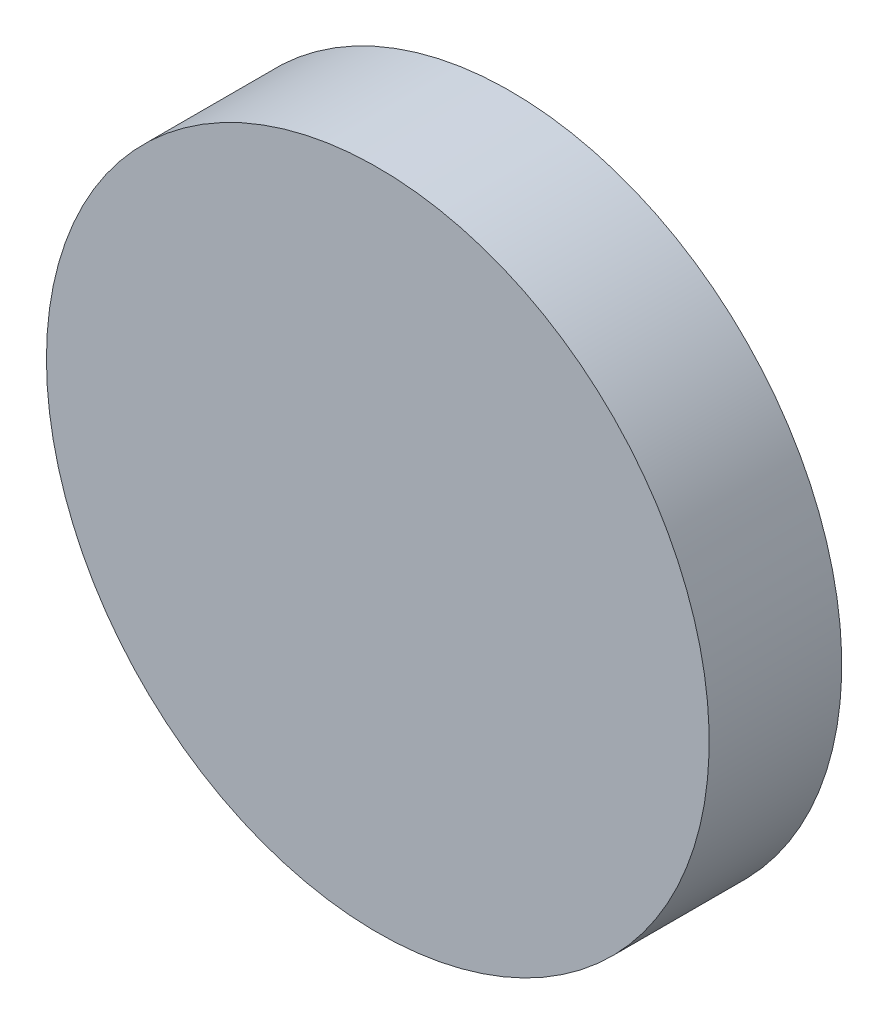
ISO-10303-21;
HEADER;
FILE_DESCRIPTION(('STEP AP214'),'2;1');
FILE_NAME('part.step','',(''),(''),'','','');
FILE_SCHEMA(('AUTOMOTIVE_DESIGN { 1 0 10303 214 1 1 1 1 }'));
ENDSEC;
DATA;
#1=APPLICATION_CONTEXT('core data for automotive mechanical design processes');
#2=APPLICATION_PROTOCOL_DEFINITION('international standard','automotive_design',2000,#1);
#3=PRODUCT_CONTEXT('',#1,'mechanical');
#4=PRODUCT('Part','Part','',(#3));
#5=PRODUCT_RELATED_PRODUCT_CATEGORY('part','',(#4));
#6=PRODUCT_DEFINITION_FORMATION('','',#4);
#7=PRODUCT_DEFINITION_CONTEXT('part definition',#1,'design');
#8=PRODUCT_DEFINITION('design','',#6,#7);
#9=PRODUCT_DEFINITION_SHAPE('','',#8);
#10=(LENGTH_UNIT() NAMED_UNIT(*) SI_UNIT(.MILLI.,.METRE.));
#11=(NAMED_UNIT(*) PLANE_ANGLE_UNIT() SI_UNIT($,.RADIAN.));
#12=(NAMED_UNIT(*) SI_UNIT($,.STERADIAN.) SOLID_ANGLE_UNIT());
#13=UNCERTAINTY_MEASURE_WITH_UNIT(LENGTH_MEASURE(1.E-05),#10,'distance_accuracy_value','');
#14=(GEOMETRIC_REPRESENTATION_CONTEXT(3) GLOBAL_UNCERTAINTY_ASSIGNED_CONTEXT((#13)) GLOBAL_UNIT_ASSIGNED_CONTEXT((#10,
#11,#12)) REPRESENTATION_CONTEXT('',''));
#15=CARTESIAN_POINT('',(0.,0.,0.));
#16=DIRECTION('',(0.,0.,1.));
#17=DIRECTION('',(1.,0.,0.));
#18=AXIS2_PLACEMENT_3D('',#15,#16,#17);
#19=CARTESIAN_POINT('',(0.,0.,20.));
#20=DIRECTION('',(0.,0.,1.));
#21=DIRECTION('',(1.,0.,0.));
#22=AXIS2_PLACEMENT_3D('',#19,#20,#21);
#23=PLANE('',#22);
#24=CARTESIAN_POINT('',(0.,0.,20.));
#25=DIRECTION('',(0.,0.,-1.));
#26=DIRECTION('',(-1.,0.,0.));
#27=AXIS2_PLACEMENT_3D('',#24,#25,#26);
#28=CIRCLE('',#27,50.);
#29=CARTESIAN_POINT('',(-50.,0.,20.));
#30=VERTEX_POINT('',#29);
#31=EDGE_CURVE('E54',#30,#30,#28,.T.);
#32=ORIENTED_EDGE('',*,*,#31,.F.);
#33=EDGE_LOOP('',(#32));
#34=FACE_BOUND('',#33,.T.);
#35=ADVANCED_FACE('F37',(#34),#23,.T.);
#36=CARTESIAN_POINT('',(0.,0.,10.));
#37=DIRECTION('',(0.,0.,1.));
#38=DIRECTION('',(1.,0.,0.));
#39=AXIS2_PLACEMENT_3D('',#36,#37,#38);
#40=PLANE('',#39);
#41=CARTESIAN_POINT('',(0.,0.,10.));
#42=DIRECTION('',(0.,0.,-1.));
#43=DIRECTION('',(-1.,0.,0.));
#44=AXIS2_PLACEMENT_3D('',#41,#42,#43);
#45=CIRCLE('',#44,40.);
#46=CARTESIAN_POINT('',(-40.,0.,10.));
#47=VERTEX_POINT('',#46);
#48=EDGE_CURVE('E10',#47,#47,#45,.T.);
#49=ORIENTED_EDGE('',*,*,#48,.T.);
#50=EDGE_LOOP('',(#49));
#51=FACE_BOUND('',#50,.T.);
#52=ADVANCED_FACE('F65',(#51),#40,.F.);
#53=CARTESIAN_POINT('',(0.,0.,0.));
#54=DIRECTION('',(0.,0.,-1.));
#55=DIRECTION('',(-1.,0.,0.));
#56=AXIS2_PLACEMENT_3D('',#53,#54,#55);
#57=CYLINDRICAL_SURFACE('',#56,40.);
#58=ORIENTED_EDGE('',*,*,#48,.F.);
#59=EDGE_LOOP('',(#58));
#60=FACE_BOUND('',#59,.T.);
#61=CARTESIAN_POINT('',(0.,0.,0.));
#62=DIRECTION('',(0.,0.,-1.));
#63=DIRECTION('',(-1.,0.,0.));
#64=AXIS2_PLACEMENT_3D('',#61,#62,#63);
#65=CIRCLE('',#64,40.);
#66=CARTESIAN_POINT('',(-40.,0.,0.));
#67=VERTEX_POINT('',#66);
#68=EDGE_CURVE('E44',#67,#67,#65,.T.);
#69=ORIENTED_EDGE('',*,*,#68,.T.);
#70=EDGE_LOOP('',(#69));
#71=FACE_BOUND('',#70,.T.);
#72=ADVANCED_FACE('F69',(#60,#71),#57,.F.);
#73=CARTESIAN_POINT('',(0.,0.,0.));
#74=DIRECTION('',(0.,0.,1.));
#75=DIRECTION('',(1.,0.,0.));
#76=AXIS2_PLACEMENT_3D('',#73,#74,#75);
#77=PLANE('',#76);
#78=ORIENTED_EDGE('',*,*,#68,.F.);
#79=EDGE_LOOP('',(#78));
#80=FACE_BOUND('',#79,.T.);
#81=CARTESIAN_POINT('',(0.,0.,0.));
#82=DIRECTION('',(0.,0.,-1.));
#83=DIRECTION('',(-1.,0.,0.));
#84=AXIS2_PLACEMENT_3D('',#81,#82,#83);
#85=CIRCLE('',#84,50.);
#86=CARTESIAN_POINT('',(-50.,0.,0.));
#87=VERTEX_POINT('',#86);
#88=EDGE_CURVE('E49',#87,#87,#85,.T.);
#89=ORIENTED_EDGE('',*,*,#88,.T.);
#90=EDGE_LOOP('',(#89));
#91=FACE_BOUND('',#90,.T.);
#92=ADVANCED_FACE('F73',(#80,#91),#77,.F.);
#93=CARTESIAN_POINT('',(0.,0.,0.));
#94=DIRECTION('',(0.,0.,-1.));
#95=DIRECTION('',(-1.,0.,0.));
#96=AXIS2_PLACEMENT_3D('',#93,#94,#95);
#97=CYLINDRICAL_SURFACE('',#96,50.);
#98=ORIENTED_EDGE('',*,*,#31,.T.);
#99=EDGE_LOOP('',(#98));
#100=FACE_BOUND('',#99,.T.);
#101=ORIENTED_EDGE('',*,*,#88,.F.);
#102=EDGE_LOOP('',(#101));
#103=FACE_BOUND('',#102,.T.);
#104=ADVANCED_FACE('F61',(#100,#103),#97,.T.);
#105=CLOSED_SHELL('',(#35,#52,#72,#92,#104));
#106=MANIFOLD_SOLID_BREP('B2',#105);
#107=ADVANCED_BREP_SHAPE_REPRESENTATION('',(#18,#106),#14);
#108=SHAPE_DEFINITION_REPRESENTATION(#9,#107);
ENDSEC;
END-ISO-10303-21;
